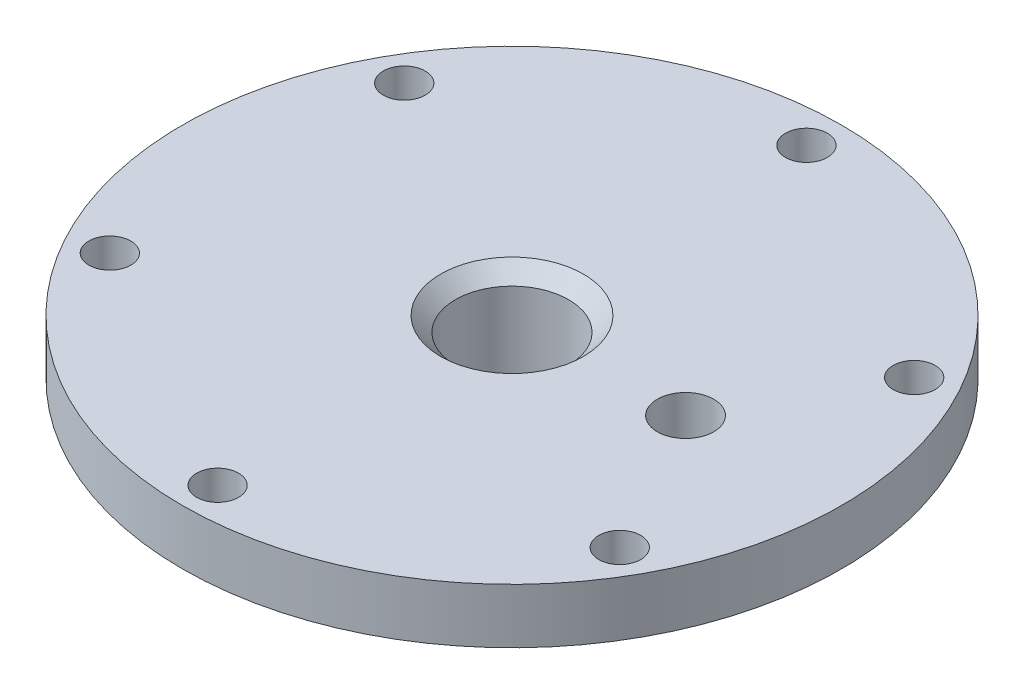
ISO-10303-21;
HEADER;
FILE_DESCRIPTION(('STEP AP214'),'2;1');
FILE_NAME('part.step','',(''),(''),'','','');
FILE_SCHEMA(('AUTOMOTIVE_DESIGN { 1 0 10303 214 1 1 1 1 }'));
ENDSEC;
DATA;
#1=APPLICATION_CONTEXT('core data for automotive mechanical design processes');
#2=APPLICATION_PROTOCOL_DEFINITION('international standard','automotive_design',2000,#1);
#3=PRODUCT_CONTEXT('',#1,'mechanical');
#4=PRODUCT('Part','Part','',(#3));
#5=PRODUCT_RELATED_PRODUCT_CATEGORY('part','',(#4));
#6=PRODUCT_DEFINITION_FORMATION('','',#4);
#7=PRODUCT_DEFINITION_CONTEXT('part definition',#1,'design');
#8=PRODUCT_DEFINITION('design','',#6,#7);
#9=PRODUCT_DEFINITION_SHAPE('','',#8);
#10=(LENGTH_UNIT() NAMED_UNIT(*) SI_UNIT(.MILLI.,.METRE.));
#11=(NAMED_UNIT(*) PLANE_ANGLE_UNIT() SI_UNIT($,.RADIAN.));
#12=(NAMED_UNIT(*) SI_UNIT($,.STERADIAN.) SOLID_ANGLE_UNIT());
#13=UNCERTAINTY_MEASURE_WITH_UNIT(LENGTH_MEASURE(1.E-05),#10,'distance_accuracy_value','');
#14=(GEOMETRIC_REPRESENTATION_CONTEXT(3) GLOBAL_UNCERTAINTY_ASSIGNED_CONTEXT((#13)) GLOBAL_UNIT_ASSIGNED_CONTEXT((#10,
#11,#12)) REPRESENTATION_CONTEXT('',''));
#15=CARTESIAN_POINT('',(0.,0.,0.));
#16=DIRECTION('',(0.,0.,1.));
#17=DIRECTION('',(1.,0.,0.));
#18=AXIS2_PLACEMENT_3D('',#15,#16,#17);
#19=CARTESIAN_POINT('',(0.,6.35,0.));
#20=DIRECTION('',(0.,-1.,0.));
#21=DIRECTION('',(0.,0.,-1.));
#22=AXIS2_PLACEMENT_3D('',#19,#20,#21);
#23=CYLINDRICAL_SURFACE('',#22,38.1);
#24=CARTESIAN_POINT('',(0.,6.35,0.));
#25=DIRECTION('',(0.,1.,0.));
#26=DIRECTION('',(0.,0.,1.));
#27=AXIS2_PLACEMENT_3D('',#24,#25,#26);
#28=CIRCLE('',#27,38.1);
#29=CARTESIAN_POINT('',(0.,6.35,38.1));
#30=VERTEX_POINT('',#29);
#31=EDGE_CURVE('E41',#30,#30,#28,.T.);
#32=ORIENTED_EDGE('',*,*,#31,.F.);
#33=EDGE_LOOP('',(#32));
#34=FACE_BOUND('',#33,.T.);
#35=CARTESIAN_POINT('',(0.,0.,0.));
#36=DIRECTION('',(0.,1.,0.));
#37=DIRECTION('',(0.,0.,1.));
#38=AXIS2_PLACEMENT_3D('',#35,#36,#37);
#39=CIRCLE('',#38,38.1);
#40=CARTESIAN_POINT('',(0.,0.,38.1));
#41=VERTEX_POINT('',#40);
#42=EDGE_CURVE('E45',#41,#41,#39,.T.);
#43=ORIENTED_EDGE('',*,*,#42,.T.);
#44=EDGE_LOOP('',(#43));
#45=FACE_BOUND('',#44,.T.);
#46=ADVANCED_FACE('F35',(#34,#45),#23,.T.);
#47=CARTESIAN_POINT('',(0.,6.35,0.));
#48=DIRECTION('',(0.,1.,0.));
#49=DIRECTION('',(0.,0.,1.));
#50=AXIS2_PLACEMENT_3D('',#47,#48,#49);
#51=PLANE('',#50);
#52=CARTESIAN_POINT('',(20.066,6.35,0.));
#53=DIRECTION('',(0.,1.,0.));
#54=DIRECTION('',(0.,0.,1.));
#55=AXIS2_PLACEMENT_3D('',#52,#53,#54);
#56=CIRCLE('',#55,3.2639);
#57=CARTESIAN_POINT('',(20.066,6.35,3.2639));
#58=VERTEX_POINT('',#57);
#59=EDGE_CURVE('E102',#58,#58,#56,.T.);
#60=ORIENTED_EDGE('',*,*,#59,.F.);
#61=EDGE_LOOP('',(#60));
#62=FACE_BOUND('',#61,.T.);
#63=CARTESIAN_POINT('',(0.,6.35,0.));
#64=DIRECTION('',(0.,1.,0.));
#65=DIRECTION('',(0.,0.,1.));
#66=AXIS2_PLACEMENT_3D('',#63,#64,#65);
#67=CIRCLE('',#66,8.255);
#68=CARTESIAN_POINT('',(0.,6.35,8.255));
#69=VERTEX_POINT('',#68);
#70=EDGE_CURVE('E96',#69,#69,#67,.T.);
#71=ORIENTED_EDGE('',*,*,#70,.F.);
#72=EDGE_LOOP('',(#71));
#73=FACE_BOUND('',#72,.T.);
#74=CARTESIAN_POINT('',(29.476040643207,6.35,-17.0180000000003));
#75=DIRECTION('',(0.,1.,0.));
#76=DIRECTION('',(0.,0.,1.));
#77=AXIS2_PLACEMENT_3D('',#74,#75,#76);
#78=CIRCLE('',#77,2.4257);
#79=CARTESIAN_POINT('',(29.476040643207,6.35,-14.5923000000003));
#80=VERTEX_POINT('',#79);
#81=EDGE_CURVE('E87',#80,#80,#78,.T.);
#82=ORIENTED_EDGE('',*,*,#81,.F.);
#83=EDGE_LOOP('',(#82));
#84=FACE_BOUND('',#83,.T.);
#85=CARTESIAN_POINT('',(29.4760406432073,6.35,17.0179999999997));
#86=DIRECTION('',(0.,1.,0.));
#87=DIRECTION('',(0.,0.,1.));
#88=AXIS2_PLACEMENT_3D('',#85,#86,#87);
#89=CIRCLE('',#88,2.4257);
#90=CARTESIAN_POINT('',(29.4760406432073,6.35,19.4436999999997));
#91=VERTEX_POINT('',#90);
#92=EDGE_CURVE('E81',#91,#91,#89,.T.);
#93=ORIENTED_EDGE('',*,*,#92,.F.);
#94=EDGE_LOOP('',(#93));
#95=FACE_BOUND('',#94,.T.);
#96=CARTESIAN_POINT('',(0.,6.35,34.036));
#97=DIRECTION('',(0.,1.,0.));
#98=DIRECTION('',(0.,0.,1.));
#99=AXIS2_PLACEMENT_3D('',#96,#97,#98);
#100=CIRCLE('',#99,2.4257);
#101=CARTESIAN_POINT('',(0.,6.35,36.4617));
#102=VERTEX_POINT('',#101);
#103=EDGE_CURVE('E75',#102,#102,#100,.T.);
#104=ORIENTED_EDGE('',*,*,#103,.F.);
#105=EDGE_LOOP('',(#104));
#106=FACE_BOUND('',#105,.T.);
#107=CARTESIAN_POINT('',(-29.4760406432071,6.35,17.0180000000001));
#108=DIRECTION('',(0.,1.,0.));
#109=DIRECTION('',(0.,0.,1.));
#110=AXIS2_PLACEMENT_3D('',#107,#108,#109);
#111=CIRCLE('',#110,2.4257);
#112=CARTESIAN_POINT('',(-29.4760406432071,6.35,19.4437000000001));
#113=VERTEX_POINT('',#112);
#114=EDGE_CURVE('E69',#113,#113,#111,.T.);
#115=ORIENTED_EDGE('',*,*,#114,.F.);
#116=EDGE_LOOP('',(#115));
#117=FACE_BOUND('',#116,.T.);
#118=CARTESIAN_POINT('',(-29.4760406432072,6.35,-17.0179999999999));
#119=DIRECTION('',(0.,1.,0.));
#120=DIRECTION('',(0.,0.,1.));
#121=AXIS2_PLACEMENT_3D('',#118,#119,#120);
#122=CIRCLE('',#121,2.4257);
#123=CARTESIAN_POINT('',(-29.4760406432072,6.35,-14.5922999999999));
#124=VERTEX_POINT('',#123);
#125=EDGE_CURVE('E63',#124,#124,#122,.T.);
#126=ORIENTED_EDGE('',*,*,#125,.F.);
#127=EDGE_LOOP('',(#126));
#128=FACE_BOUND('',#127,.T.);
#129=CARTESIAN_POINT('',(0.,6.35,-34.036));
#130=DIRECTION('',(0.,1.,0.));
#131=DIRECTION('',(0.,0.,1.));
#132=AXIS2_PLACEMENT_3D('',#129,#130,#131);
#133=CIRCLE('',#132,2.4257);
#134=CARTESIAN_POINT('',(0.,6.35,-31.6103));
#135=VERTEX_POINT('',#134);
#136=EDGE_CURVE('E57',#135,#135,#133,.T.);
#137=ORIENTED_EDGE('',*,*,#136,.F.);
#138=EDGE_LOOP('',(#137));
#139=FACE_BOUND('',#138,.T.);
#140=ORIENTED_EDGE('',*,*,#31,.T.);
#141=EDGE_LOOP('',(#140));
#142=FACE_BOUND('',#141,.T.);
#143=ADVANCED_FACE('F109',(#62,#73,#84,#95,#106,#117,#128,#139,#142),#51,.T.);
#144=CARTESIAN_POINT('',(0.,0.,0.));
#145=DIRECTION('',(0.,1.,0.));
#146=DIRECTION('',(0.,0.,1.));
#147=AXIS2_PLACEMENT_3D('',#144,#145,#146);
#148=PLANE('',#147);
#149=CARTESIAN_POINT('',(29.476040643207,0.,-17.0180000000003));
#150=DIRECTION('',(0.,1.,0.));
#151=DIRECTION('',(0.,0.,1.));
#152=AXIS2_PLACEMENT_3D('',#149,#150,#151);
#153=CIRCLE('',#152,2.4257);
#154=CARTESIAN_POINT('',(29.476040643207,0.,-14.5923000000003));
#155=VERTEX_POINT('',#154);
#156=EDGE_CURVE('E84',#155,#155,#153,.T.);
#157=ORIENTED_EDGE('',*,*,#156,.T.);
#158=EDGE_LOOP('',(#157));
#159=FACE_BOUND('',#158,.T.);
#160=CARTESIAN_POINT('',(29.4760406432073,0.,17.0179999999997));
#161=DIRECTION('',(0.,1.,0.));
#162=DIRECTION('',(0.,0.,1.));
#163=AXIS2_PLACEMENT_3D('',#160,#161,#162);
#164=CIRCLE('',#163,2.4257);
#165=CARTESIAN_POINT('',(29.4760406432073,0.,19.4436999999997));
#166=VERTEX_POINT('',#165);
#167=EDGE_CURVE('E78',#166,#166,#164,.T.);
#168=ORIENTED_EDGE('',*,*,#167,.T.);
#169=EDGE_LOOP('',(#168));
#170=FACE_BOUND('',#169,.T.);
#171=CARTESIAN_POINT('',(0.,0.,34.036));
#172=DIRECTION('',(0.,1.,0.));
#173=DIRECTION('',(0.,0.,1.));
#174=AXIS2_PLACEMENT_3D('',#171,#172,#173);
#175=CIRCLE('',#174,2.4257);
#176=CARTESIAN_POINT('',(0.,0.,36.4617));
#177=VERTEX_POINT('',#176);
#178=EDGE_CURVE('E72',#177,#177,#175,.T.);
#179=ORIENTED_EDGE('',*,*,#178,.T.);
#180=EDGE_LOOP('',(#179));
#181=FACE_BOUND('',#180,.T.);
#182=CARTESIAN_POINT('',(-29.4760406432071,0.,17.0180000000001));
#183=DIRECTION('',(0.,1.,0.));
#184=DIRECTION('',(0.,0.,1.));
#185=AXIS2_PLACEMENT_3D('',#182,#183,#184);
#186=CIRCLE('',#185,2.4257);
#187=CARTESIAN_POINT('',(-29.4760406432071,0.,19.4437000000001));
#188=VERTEX_POINT('',#187);
#189=EDGE_CURVE('E66',#188,#188,#186,.T.);
#190=ORIENTED_EDGE('',*,*,#189,.T.);
#191=EDGE_LOOP('',(#190));
#192=FACE_BOUND('',#191,.T.);
#193=CARTESIAN_POINT('',(-29.4760406432072,0.,-17.0179999999999));
#194=DIRECTION('',(0.,1.,0.));
#195=DIRECTION('',(0.,0.,1.));
#196=AXIS2_PLACEMENT_3D('',#193,#194,#195);
#197=CIRCLE('',#196,2.4257);
#198=CARTESIAN_POINT('',(-29.4760406432072,0.,-14.5922999999999));
#199=VERTEX_POINT('',#198);
#200=EDGE_CURVE('E60',#199,#199,#197,.T.);
#201=ORIENTED_EDGE('',*,*,#200,.T.);
#202=EDGE_LOOP('',(#201));
#203=FACE_BOUND('',#202,.T.);
#204=CARTESIAN_POINT('',(0.,0.,-34.036));
#205=DIRECTION('',(0.,1.,0.));
#206=DIRECTION('',(0.,0.,1.));
#207=AXIS2_PLACEMENT_3D('',#204,#205,#206);
#208=CIRCLE('',#207,2.4257);
#209=CARTESIAN_POINT('',(0.,0.,-31.6103));
#210=VERTEX_POINT('',#209);
#211=EDGE_CURVE('E54',#210,#210,#208,.T.);
#212=ORIENTED_EDGE('',*,*,#211,.T.);
#213=EDGE_LOOP('',(#212));
#214=FACE_BOUND('',#213,.T.);
#215=CARTESIAN_POINT('',(0.,0.,0.));
#216=DIRECTION('',(0.,1.,0.));
#217=DIRECTION('',(0.,0.,1.));
#218=AXIS2_PLACEMENT_3D('',#215,#216,#217);
#219=CIRCLE('',#218,25.273);
#220=CARTESIAN_POINT('',(0.,0.,25.273));
#221=VERTEX_POINT('',#220);
#222=EDGE_CURVE('E10',#221,#221,#219,.F.);
#223=ORIENTED_EDGE('',*,*,#222,.F.);
#224=EDGE_LOOP('',(#223));
#225=FACE_BOUND('',#224,.T.);
#226=ORIENTED_EDGE('',*,*,#42,.F.);
#227=EDGE_LOOP('',(#226));
#228=FACE_BOUND('',#227,.T.);
#229=ADVANCED_FACE('F112',(#159,#170,#181,#192,#203,#214,#225,#228),#148,.F.);
#230=CARTESIAN_POINT('',(0.,-6.35,0.));
#231=DIRECTION('',(0.,1.,0.));
#232=DIRECTION('',(0.,0.,1.));
#233=AXIS2_PLACEMENT_3D('',#230,#231,#232);
#234=CYLINDRICAL_SURFACE('',#233,25.273);
#235=CARTESIAN_POINT('',(0.,-6.35,0.));
#236=DIRECTION('',(0.,-1.,0.));
#237=DIRECTION('',(0.,0.,-1.));
#238=AXIS2_PLACEMENT_3D('',#235,#236,#237);
#239=CIRCLE('',#238,25.273);
#240=CARTESIAN_POINT('',(0.,-6.35,-25.273));
#241=VERTEX_POINT('',#240);
#242=EDGE_CURVE('E50',#241,#241,#239,.T.);
#243=ORIENTED_EDGE('',*,*,#242,.F.);
#244=EDGE_LOOP('',(#243));
#245=FACE_BOUND('',#244,.T.);
#246=ORIENTED_EDGE('',*,*,#222,.T.);
#247=EDGE_LOOP('',(#246));
#248=FACE_BOUND('',#247,.T.);
#249=ADVANCED_FACE('F141',(#245,#248),#234,.T.);
#250=CARTESIAN_POINT('',(0.,-6.35,0.));
#251=DIRECTION('',(0.,-1.,0.));
#252=DIRECTION('',(0.,0.,-1.));
#253=AXIS2_PLACEMENT_3D('',#250,#251,#252);
#254=PLANE('',#253);
#255=CARTESIAN_POINT('',(20.066,-6.35,0.));
#256=DIRECTION('',(0.,-1.,0.));
#257=DIRECTION('',(0.,0.,-1.));
#258=AXIS2_PLACEMENT_3D('',#255,#256,#257);
#259=CIRCLE('',#258,3.2639);
#260=CARTESIAN_POINT('',(20.066,-6.35,-3.2639));
#261=VERTEX_POINT('',#260);
#262=EDGE_CURVE('E99',#261,#261,#259,.T.);
#263=ORIENTED_EDGE('',*,*,#262,.F.);
#264=EDGE_LOOP('',(#263));
#265=FACE_BOUND('',#264,.T.);
#266=CARTESIAN_POINT('',(0.,-6.35,0.));
#267=DIRECTION('',(0.,1.,0.));
#268=DIRECTION('',(0.,0.,1.));
#269=AXIS2_PLACEMENT_3D('',#266,#267,#268);
#270=CIRCLE('',#269,6.54811999999999);
#271=CARTESIAN_POINT('',(0.,-6.35,6.54811999999999));
#272=VERTEX_POINT('',#271);
#273=EDGE_CURVE('E90',#272,#272,#270,.T.);
#274=ORIENTED_EDGE('',*,*,#273,.T.);
#275=EDGE_LOOP('',(#274));
#276=FACE_BOUND('',#275,.T.);
#277=ORIENTED_EDGE('',*,*,#242,.T.);
#278=EDGE_LOOP('',(#277));
#279=FACE_BOUND('',#278,.T.);
#280=ADVANCED_FACE('F131',(#265,#276,#279),#254,.T.);
#281=CARTESIAN_POINT('',(0.,6.35,-34.036));
#282=DIRECTION('',(0.,1.,0.));
#283=DIRECTION('',(0.,0.,1.));
#284=AXIS2_PLACEMENT_3D('',#281,#282,#283);
#285=CYLINDRICAL_SURFACE('',#284,2.4257);
#286=ORIENTED_EDGE('',*,*,#211,.F.);
#287=EDGE_LOOP('',(#286));
#288=FACE_BOUND('',#287,.T.);
#289=ORIENTED_EDGE('',*,*,#136,.T.);
#290=EDGE_LOOP('',(#289));
#291=FACE_BOUND('',#290,.T.);
#292=ADVANCED_FACE('F128',(#288,#291),#285,.F.);
#293=CARTESIAN_POINT('',(-29.4760406432072,6.35,-17.0179999999999));
#294=DIRECTION('',(0.,1.,0.));
#295=DIRECTION('',(0.,0.,1.));
#296=AXIS2_PLACEMENT_3D('',#293,#294,#295);
#297=CYLINDRICAL_SURFACE('',#296,2.4257);
#298=ORIENTED_EDGE('',*,*,#200,.F.);
#299=EDGE_LOOP('',(#298));
#300=FACE_BOUND('',#299,.T.);
#301=ORIENTED_EDGE('',*,*,#125,.T.);
#302=EDGE_LOOP('',(#301));
#303=FACE_BOUND('',#302,.T.);
#304=ADVANCED_FACE('F130',(#300,#303),#297,.F.);
#305=CARTESIAN_POINT('',(-29.4760406432071,6.35,17.0180000000001));
#306=DIRECTION('',(0.,1.,0.));
#307=DIRECTION('',(0.,0.,1.));
#308=AXIS2_PLACEMENT_3D('',#305,#306,#307);
#309=CYLINDRICAL_SURFACE('',#308,2.4257);
#310=ORIENTED_EDGE('',*,*,#189,.F.);
#311=EDGE_LOOP('',(#310));
#312=FACE_BOUND('',#311,.T.);
#313=ORIENTED_EDGE('',*,*,#114,.T.);
#314=EDGE_LOOP('',(#313));
#315=FACE_BOUND('',#314,.T.);
#316=ADVANCED_FACE('F138',(#312,#315),#309,.F.);
#317=CARTESIAN_POINT('',(0.,6.35,34.036));
#318=DIRECTION('',(0.,1.,0.));
#319=DIRECTION('',(0.,0.,1.));
#320=AXIS2_PLACEMENT_3D('',#317,#318,#319);
#321=CYLINDRICAL_SURFACE('',#320,2.4257);
#322=ORIENTED_EDGE('',*,*,#178,.F.);
#323=EDGE_LOOP('',(#322));
#324=FACE_BOUND('',#323,.T.);
#325=ORIENTED_EDGE('',*,*,#103,.T.);
#326=EDGE_LOOP('',(#325));
#327=FACE_BOUND('',#326,.T.);
#328=ADVANCED_FACE('F174',(#324,#327),#321,.F.);
#329=CARTESIAN_POINT('',(29.4760406432073,6.35,17.0179999999997));
#330=DIRECTION('',(0.,1.,0.));
#331=DIRECTION('',(0.,0.,1.));
#332=AXIS2_PLACEMENT_3D('',#329,#330,#331);
#333=CYLINDRICAL_SURFACE('',#332,2.4257);
#334=ORIENTED_EDGE('',*,*,#167,.F.);
#335=EDGE_LOOP('',(#334));
#336=FACE_BOUND('',#335,.T.);
#337=ORIENTED_EDGE('',*,*,#92,.T.);
#338=EDGE_LOOP('',(#337));
#339=FACE_BOUND('',#338,.T.);
#340=ADVANCED_FACE('F179',(#336,#339),#333,.F.);
#341=CARTESIAN_POINT('',(29.476040643207,6.35,-17.0180000000003));
#342=DIRECTION('',(0.,1.,0.));
#343=DIRECTION('',(0.,0.,1.));
#344=AXIS2_PLACEMENT_3D('',#341,#342,#343);
#345=CYLINDRICAL_SURFACE('',#344,2.4257);
#346=ORIENTED_EDGE('',*,*,#156,.F.);
#347=EDGE_LOOP('',(#346));
#348=FACE_BOUND('',#347,.T.);
#349=ORIENTED_EDGE('',*,*,#81,.T.);
#350=EDGE_LOOP('',(#349));
#351=FACE_BOUND('',#350,.T.);
#352=ADVANCED_FACE('F185',(#348,#351),#345,.F.);
#353=CARTESIAN_POINT('',(0.,6.35,0.));
#354=DIRECTION('',(0.,1.,0.));
#355=DIRECTION('',(0.,0.,1.));
#356=AXIS2_PLACEMENT_3D('',#353,#354,#355);
#357=CYLINDRICAL_SURFACE('',#356,6.54811999999999);
#358=ORIENTED_EDGE('',*,*,#273,.F.);
#359=EDGE_LOOP('',(#358));
#360=FACE_BOUND('',#359,.T.);
#361=CARTESIAN_POINT('',(0.,4.64312,0.));
#362=DIRECTION('',(0.,1.,0.));
#363=DIRECTION('',(0.,0.,1.));
#364=AXIS2_PLACEMENT_3D('',#361,#362,#363);
#365=CIRCLE('',#364,6.54812);
#366=CARTESIAN_POINT('',(0.,4.64312,6.54812));
#367=VERTEX_POINT('',#366);
#368=EDGE_CURVE('E93',#367,#367,#365,.T.);
#369=ORIENTED_EDGE('',*,*,#368,.T.);
#370=EDGE_LOOP('',(#369));
#371=FACE_BOUND('',#370,.T.);
#372=ADVANCED_FACE('F189',(#360,#371),#357,.F.);
#373=CARTESIAN_POINT('',(0.,6.35,0.));
#374=DIRECTION('',(0.,1.,0.));
#375=DIRECTION('',(0.,0.,1.));
#376=AXIS2_PLACEMENT_3D('',#373,#374,#375);
#377=CONICAL_SURFACE('',#376,8.255,0.78539816339745);
#378=ORIENTED_EDGE('',*,*,#368,.F.);
#379=EDGE_LOOP('',(#378));
#380=FACE_BOUND('',#379,.T.);
#381=ORIENTED_EDGE('',*,*,#70,.T.);
#382=EDGE_LOOP('',(#381));
#383=FACE_BOUND('',#382,.T.);
#384=ADVANCED_FACE('F193',(#380,#383),#377,.F.);
#385=CARTESIAN_POINT('',(20.066,6.35,0.));
#386=DIRECTION('',(0.,1.,0.));
#387=DIRECTION('',(0.,0.,1.));
#388=AXIS2_PLACEMENT_3D('',#385,#386,#387);
#389=CYLINDRICAL_SURFACE('',#388,3.2639);
#390=ORIENTED_EDGE('',*,*,#59,.T.);
#391=EDGE_LOOP('',(#390));
#392=FACE_BOUND('',#391,.T.);
#393=ORIENTED_EDGE('',*,*,#262,.T.);
#394=EDGE_LOOP('',(#393));
#395=FACE_BOUND('',#394,.T.);
#396=ADVANCED_FACE('F106',(#392,#395),#389,.F.);
#397=CLOSED_SHELL('',(#46,#143,#229,#249,#280,#292,#304,#316,#328,#340,#352,#372,#384,#396));
#398=MANIFOLD_SOLID_BREP('B2',#397);
#399=ADVANCED_BREP_SHAPE_REPRESENTATION('',(#18,#398),#14);
#400=SHAPE_DEFINITION_REPRESENTATION(#9,#399);
ENDSEC;
END-ISO-10303-21;
